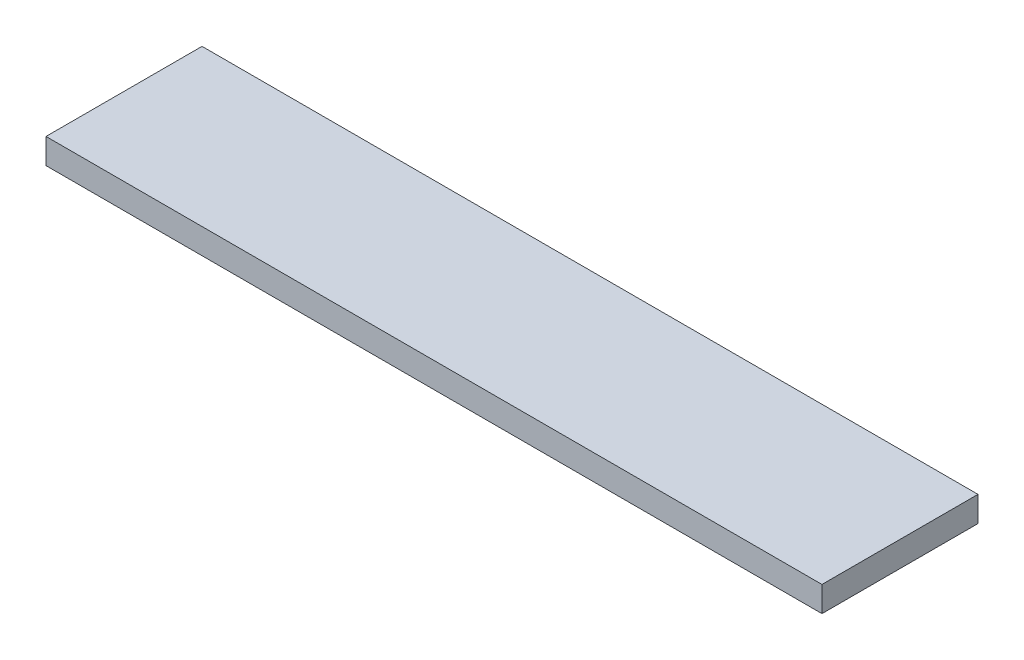
ISO-10303-21;
HEADER;
FILE_DESCRIPTION(('STEP AP214'),'2;1');
FILE_NAME('part.step','',(''),(''),'','','');
FILE_SCHEMA(('AUTOMOTIVE_DESIGN { 1 0 10303 214 1 1 1 1 }'));
ENDSEC;
DATA;
#1=APPLICATION_CONTEXT('core data for automotive mechanical design processes');
#2=APPLICATION_PROTOCOL_DEFINITION('international standard','automotive_design',2000,#1);
#3=PRODUCT_CONTEXT('',#1,'mechanical');
#4=PRODUCT('Part','Part','',(#3));
#5=PRODUCT_RELATED_PRODUCT_CATEGORY('part','',(#4));
#6=PRODUCT_DEFINITION_FORMATION('','',#4);
#7=PRODUCT_DEFINITION_CONTEXT('part definition',#1,'design');
#8=PRODUCT_DEFINITION('design','',#6,#7);
#9=PRODUCT_DEFINITION_SHAPE('','',#8);
#10=(LENGTH_UNIT() NAMED_UNIT(*) SI_UNIT(.MILLI.,.METRE.));
#11=(NAMED_UNIT(*) PLANE_ANGLE_UNIT() SI_UNIT($,.RADIAN.));
#12=(NAMED_UNIT(*) SI_UNIT($,.STERADIAN.) SOLID_ANGLE_UNIT());
#13=UNCERTAINTY_MEASURE_WITH_UNIT(LENGTH_MEASURE(1.E-05),#10,'distance_accuracy_value','');
#14=(GEOMETRIC_REPRESENTATION_CONTEXT(3) GLOBAL_UNCERTAINTY_ASSIGNED_CONTEXT((#13)) GLOBAL_UNIT_ASSIGNED_CONTEXT((#10,
#11,#12)) REPRESENTATION_CONTEXT('',''));
#15=CARTESIAN_POINT('',(0.,0.,0.));
#16=DIRECTION('',(0.,0.,1.));
#17=DIRECTION('',(1.,0.,0.));
#18=AXIS2_PLACEMENT_3D('',#15,#16,#17);
#19=CARTESIAN_POINT('',(-423.690620139309,38.1000000000002,-404.215053763441));
#20=DIRECTION('',(1.,0.,0.));
#21=DIRECTION('',(0.,0.,-1.));
#22=AXIS2_PLACEMENT_3D('',#19,#20,#21);
#23=PLANE('',#22);
#24=DIRECTION('',(0.,0.,1.));
#25=VECTOR('',#24,1.);
#26=CARTESIAN_POINT('',(-423.690620139309,1.11022302462516E-13,-404.215053763441));
#27=LINE('',#26,#25);
#28=CARTESIAN_POINT('',(-423.690620139309,1.11022302462516E-13,-404.215053763441));
#29=VERTEX_POINT('',#28);
#30=CARTESIAN_POINT('',(-423.690620139309,4.44089209850063E-13,-169.265053763441));
#31=VERTEX_POINT('',#30);
#32=EDGE_CURVE('E95',#29,#31,#27,.T.);
#33=ORIENTED_EDGE('',*,*,#32,.T.);
#34=DIRECTION('',(0.,-1.,0.));
#35=VECTOR('',#34,1.);
#36=CARTESIAN_POINT('',(-423.690620139309,38.1000000000002,-169.265053763441));
#37=LINE('',#36,#35);
#38=CARTESIAN_POINT('',(-423.690620139309,38.1000000000002,-169.265053763441));
#39=VERTEX_POINT('',#38);
#40=EDGE_CURVE('E11',#39,#31,#37,.T.);
#41=ORIENTED_EDGE('',*,*,#40,.F.);
#42=DIRECTION('',(0.,0.,1.));
#43=VECTOR('',#42,1.);
#44=CARTESIAN_POINT('',(-423.690620139309,38.1000000000002,-404.215053763441));
#45=LINE('',#44,#43);
#46=CARTESIAN_POINT('',(-423.690620139309,38.1000000000002,-404.215053763441));
#47=VERTEX_POINT('',#46);
#48=EDGE_CURVE('E81',#47,#39,#45,.T.);
#49=ORIENTED_EDGE('',*,*,#48,.F.);
#50=DIRECTION('',(0.,-1.,0.));
#51=VECTOR('',#50,1.);
#52=CARTESIAN_POINT('',(-423.690620139309,38.1000000000002,-404.215053763441));
#53=LINE('',#52,#51);
#54=EDGE_CURVE('E48',#47,#29,#53,.T.);
#55=ORIENTED_EDGE('',*,*,#54,.T.);
#56=EDGE_LOOP('',(#33,#41,#49,#55));
#57=FACE_BOUND('',#56,.T.);
#58=ADVANCED_FACE('F32',(#57),#23,.F.);
#59=CARTESIAN_POINT('',(-423.690620139309,38.1000000000002,-169.265053763441));
#60=DIRECTION('',(0.,0.,-1.));
#61=DIRECTION('',(-1.,0.,0.));
#62=AXIS2_PLACEMENT_3D('',#59,#60,#61);
#63=PLANE('',#62);
#64=DIRECTION('',(1.,0.,0.));
#65=VECTOR('',#64,1.);
#66=CARTESIAN_POINT('',(-423.690620139309,4.44089209850063E-13,-169.265053763441));
#67=LINE('',#66,#65);
#68=CARTESIAN_POINT('',(744.709379860687,4.44089209850063E-13,-169.265053763441));
#69=VERTEX_POINT('',#68);
#70=EDGE_CURVE('E86',#31,#69,#67,.T.);
#71=ORIENTED_EDGE('',*,*,#70,.T.);
#72=DIRECTION('',(0.,-1.,0.));
#73=VECTOR('',#72,1.);
#74=CARTESIAN_POINT('',(744.709379860687,38.1000000000002,-169.265053763441));
#75=LINE('',#74,#73);
#76=CARTESIAN_POINT('',(744.709379860687,38.1000000000002,-169.265053763441));
#77=VERTEX_POINT('',#76);
#78=EDGE_CURVE('E40',#77,#69,#75,.T.);
#79=ORIENTED_EDGE('',*,*,#78,.F.);
#80=DIRECTION('',(1.,0.,0.));
#81=VECTOR('',#80,1.);
#82=CARTESIAN_POINT('',(-423.690620139309,38.1000000000002,-169.265053763441));
#83=LINE('',#82,#81);
#84=EDGE_CURVE('E73',#39,#77,#83,.T.);
#85=ORIENTED_EDGE('',*,*,#84,.F.);
#86=ORIENTED_EDGE('',*,*,#40,.T.);
#87=EDGE_LOOP('',(#71,#79,#85,#86));
#88=FACE_BOUND('',#87,.T.);
#89=ADVANCED_FACE('F85',(#88),#63,.F.);
#90=CARTESIAN_POINT('',(744.709379860687,38.1000000000002,-404.215053763441));
#91=DIRECTION('',(1.,0.,0.));
#92=DIRECTION('',(0.,0.,-1.));
#93=AXIS2_PLACEMENT_3D('',#90,#91,#92);
#94=PLANE('',#93);
#95=DIRECTION('',(0.,0.,1.));
#96=VECTOR('',#95,1.);
#97=CARTESIAN_POINT('',(744.709379860687,1.11022302462516E-13,-404.215053763441));
#98=LINE('',#97,#96);
#99=CARTESIAN_POINT('',(744.709379860687,1.11022302462516E-13,-404.215053763441));
#100=VERTEX_POINT('',#99);
#101=EDGE_CURVE('E98',#100,#69,#98,.T.);
#102=ORIENTED_EDGE('',*,*,#101,.F.);
#103=DIRECTION('',(0.,-1.,0.));
#104=VECTOR('',#103,1.);
#105=CARTESIAN_POINT('',(744.709379860687,38.1000000000002,-404.215053763441));
#106=LINE('',#105,#104);
#107=CARTESIAN_POINT('',(744.709379860687,38.1000000000002,-404.215053763441));
#108=VERTEX_POINT('',#107);
#109=EDGE_CURVE('E62',#108,#100,#106,.T.);
#110=ORIENTED_EDGE('',*,*,#109,.F.);
#111=DIRECTION('',(0.,0.,1.));
#112=VECTOR('',#111,1.);
#113=CARTESIAN_POINT('',(744.709379860687,38.1000000000002,-404.215053763441));
#114=LINE('',#113,#112);
#115=EDGE_CURVE('E80',#108,#77,#114,.T.);
#116=ORIENTED_EDGE('',*,*,#115,.T.);
#117=ORIENTED_EDGE('',*,*,#78,.T.);
#118=EDGE_LOOP('',(#102,#110,#116,#117));
#119=FACE_BOUND('',#118,.T.);
#120=ADVANCED_FACE('F89',(#119),#94,.T.);
#121=CARTESIAN_POINT('',(-423.690620139309,38.1000000000002,-404.215053763441));
#122=DIRECTION('',(0.,0.,-1.));
#123=DIRECTION('',(-1.,0.,0.));
#124=AXIS2_PLACEMENT_3D('',#121,#122,#123);
#125=PLANE('',#124);
#126=DIRECTION('',(1.,0.,0.));
#127=VECTOR('',#126,1.);
#128=CARTESIAN_POINT('',(-423.690620139309,1.11022302462516E-13,-404.215053763441));
#129=LINE('',#128,#127);
#130=EDGE_CURVE('E100',#29,#100,#129,.T.);
#131=ORIENTED_EDGE('',*,*,#130,.F.);
#132=ORIENTED_EDGE('',*,*,#54,.F.);
#133=DIRECTION('',(1.,0.,0.));
#134=VECTOR('',#133,1.);
#135=CARTESIAN_POINT('',(-423.690620139309,38.1000000000002,-404.215053763441));
#136=LINE('',#135,#134);
#137=EDGE_CURVE('E90',#47,#108,#136,.T.);
#138=ORIENTED_EDGE('',*,*,#137,.T.);
#139=ORIENTED_EDGE('',*,*,#109,.T.);
#140=EDGE_LOOP('',(#131,#132,#138,#139));
#141=FACE_BOUND('',#140,.T.);
#142=ADVANCED_FACE('F106',(#141),#125,.T.);
#143=CARTESIAN_POINT('',(0.,38.1000000000001,0.));
#144=DIRECTION('',(0.,1.,0.));
#145=DIRECTION('',(0.,0.,1.));
#146=AXIS2_PLACEMENT_3D('',#143,#144,#145);
#147=PLANE('',#146);
#148=ORIENTED_EDGE('',*,*,#48,.T.);
#149=ORIENTED_EDGE('',*,*,#84,.T.);
#150=ORIENTED_EDGE('',*,*,#115,.F.);
#151=ORIENTED_EDGE('',*,*,#137,.F.);
#152=EDGE_LOOP('',(#148,#149,#150,#151));
#153=FACE_BOUND('',#152,.T.);
#154=ADVANCED_FACE('F77',(#153),#147,.T.);
#155=CARTESIAN_POINT('',(0.,0.,0.));
#156=DIRECTION('',(0.,1.,0.));
#157=DIRECTION('',(0.,0.,1.));
#158=AXIS2_PLACEMENT_3D('',#155,#156,#157);
#159=PLANE('',#158);
#160=ORIENTED_EDGE('',*,*,#32,.F.);
#161=ORIENTED_EDGE('',*,*,#130,.T.);
#162=ORIENTED_EDGE('',*,*,#101,.T.);
#163=ORIENTED_EDGE('',*,*,#70,.F.);
#164=EDGE_LOOP('',(#160,#161,#162,#163));
#165=FACE_BOUND('',#164,.T.);
#166=ADVANCED_FACE('F105',(#165),#159,.F.);
#167=CLOSED_SHELL('',(#58,#89,#120,#142,#154,#166));
#168=MANIFOLD_SOLID_BREP('B2',#167);
#169=ADVANCED_BREP_SHAPE_REPRESENTATION('',(#18,#168),#14);
#170=SHAPE_DEFINITION_REPRESENTATION(#9,#169);
ENDSEC;
END-ISO-10303-21;
